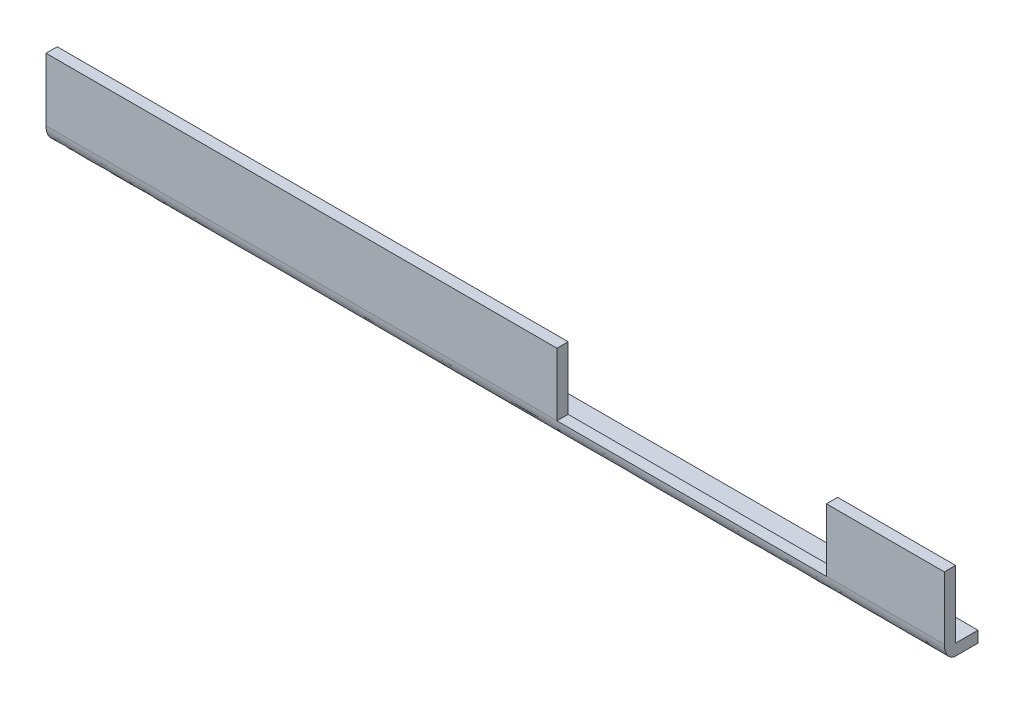
ISO-10303-21;
HEADER;
FILE_DESCRIPTION(('STEP AP214'),'2;1');
FILE_NAME('part.step','',(''),(''),'','','');
FILE_SCHEMA(('AUTOMOTIVE_DESIGN { 1 0 10303 214 1 1 1 1 }'));
ENDSEC;
DATA;
#1=APPLICATION_CONTEXT('core data for automotive mechanical design processes');
#2=APPLICATION_PROTOCOL_DEFINITION('international standard','automotive_design',2000,#1);
#3=PRODUCT_CONTEXT('',#1,'mechanical');
#4=PRODUCT('Part','Part','',(#3));
#5=PRODUCT_RELATED_PRODUCT_CATEGORY('part','',(#4));
#6=PRODUCT_DEFINITION_FORMATION('','',#4);
#7=PRODUCT_DEFINITION_CONTEXT('part definition',#1,'design');
#8=PRODUCT_DEFINITION('design','',#6,#7);
#9=PRODUCT_DEFINITION_SHAPE('','',#8);
#10=(LENGTH_UNIT() NAMED_UNIT(*) SI_UNIT(.MILLI.,.METRE.));
#11=(NAMED_UNIT(*) PLANE_ANGLE_UNIT() SI_UNIT($,.RADIAN.));
#12=(NAMED_UNIT(*) SI_UNIT($,.STERADIAN.) SOLID_ANGLE_UNIT());
#13=UNCERTAINTY_MEASURE_WITH_UNIT(LENGTH_MEASURE(1.E-05),#10,'distance_accuracy_value','');
#14=(GEOMETRIC_REPRESENTATION_CONTEXT(3) GLOBAL_UNCERTAINTY_ASSIGNED_CONTEXT((#13)) GLOBAL_UNIT_ASSIGNED_CONTEXT((#10,
#11,#12)) REPRESENTATION_CONTEXT('',''));
#15=CARTESIAN_POINT('',(0.,0.,0.));
#16=DIRECTION('',(0.,0.,1.));
#17=DIRECTION('',(1.,0.,0.));
#18=AXIS2_PLACEMENT_3D('',#15,#16,#17);
#19=CARTESIAN_POINT('',(-167.295597484277,147.91934618496,5.));
#20=DIRECTION('',(0.,-1.,0.));
#21=DIRECTION('',(0.,0.,-1.));
#22=AXIS2_PLACEMENT_3D('',#19,#20,#21);
#23=PLANE('',#22);
#24=DIRECTION('',(0.,0.,1.));
#25=VECTOR('',#24,1.);
#26=CARTESIAN_POINT('',(60.2044025157233,147.91934618496,-5.));
#27=LINE('',#26,#25);
#28=CARTESIAN_POINT('',(60.2044025157233,147.91934618496,0.));
#29=VERTEX_POINT('',#28);
#30=CARTESIAN_POINT('',(60.2044025157233,147.91934618496,5.));
#31=VERTEX_POINT('',#30);
#32=EDGE_CURVE('E158',#29,#31,#27,.T.);
#33=ORIENTED_EDGE('',*,*,#32,.F.);
#34=DIRECTION('',(-1.,0.,0.));
#35=VECTOR('',#34,1.);
#36=CARTESIAN_POINT('',(-167.295597484277,147.91934618496,0.));
#37=LINE('',#36,#35);
#38=CARTESIAN_POINT('',(-167.295597484277,147.91934618496,0.));
#39=VERTEX_POINT('',#38);
#40=EDGE_CURVE('E180',#29,#39,#37,.T.);
#41=ORIENTED_EDGE('',*,*,#40,.T.);
#42=DIRECTION('',(0.,0.,-1.));
#43=VECTOR('',#42,1.);
#44=CARTESIAN_POINT('',(-167.295597484277,147.91934618496,5.));
#45=LINE('',#44,#43);
#46=CARTESIAN_POINT('',(-167.295597484277,147.91934618496,5.));
#47=VERTEX_POINT('',#46);
#48=EDGE_CURVE('E164',#47,#39,#45,.T.);
#49=ORIENTED_EDGE('',*,*,#48,.F.);
#50=DIRECTION('',(-1.,0.,0.));
#51=VECTOR('',#50,1.);
#52=CARTESIAN_POINT('',(-167.295597484277,147.91934618496,5.));
#53=LINE('',#52,#51);
#54=EDGE_CURVE('E165',#31,#47,#53,.T.);
#55=ORIENTED_EDGE('',*,*,#54,.F.);
#56=EDGE_LOOP('',(#33,#41,#49,#55));
#57=FACE_BOUND('',#56,.T.);
#58=ADVANCED_FACE('F50',(#57),#23,.F.);
#59=CARTESIAN_POINT('',(0.,0.,0.));
#60=DIRECTION('',(0.,0.,1.));
#61=DIRECTION('',(1.,0.,0.));
#62=AXIS2_PLACEMENT_3D('',#59,#60,#61);
#63=PLANE('',#62);
#64=DIRECTION('',(0.,-1.,0.));
#65=VECTOR('',#64,1.);
#66=CARTESIAN_POINT('',(180.204402515723,0.,0.));
#67=LINE('',#66,#65);
#68=CARTESIAN_POINT('',(180.204402515723,147.91934618496,0.));
#69=VERTEX_POINT('',#68);
#70=CARTESIAN_POINT('',(180.204402515723,119.91934618496,0.));
#71=VERTEX_POINT('',#70);
#72=EDGE_CURVE('E331',#69,#71,#67,.T.);
#73=ORIENTED_EDGE('',*,*,#72,.F.);
#74=CARTESIAN_POINT('',(232.704402515723,147.91934618496,0.));
#75=VERTEX_POINT('',#74);
#76=EDGE_CURVE('E157',#75,#69,#37,.T.);
#77=ORIENTED_EDGE('',*,*,#76,.F.);
#78=DIRECTION('',(0.,1.,0.));
#79=VECTOR('',#78,1.);
#80=CARTESIAN_POINT('',(232.704402515723,147.91934618496,0.));
#81=LINE('',#80,#79);
#82=CARTESIAN_POINT('',(232.704402515723,117.91934618496,0.));
#83=VERTEX_POINT('',#82);
#84=EDGE_CURVE('E177',#83,#75,#81,.T.);
#85=ORIENTED_EDGE('',*,*,#84,.F.);
#86=DIRECTION('',(1.,0.,0.));
#87=VECTOR('',#86,1.);
#88=CARTESIAN_POINT('',(232.704402515723,117.91934618496,0.));
#89=LINE('',#88,#87);
#90=CARTESIAN_POINT('',(-167.295597484277,117.91934618496,0.));
#91=VERTEX_POINT('',#90);
#92=EDGE_CURVE('E302',#91,#83,#89,.T.);
#93=ORIENTED_EDGE('',*,*,#92,.F.);
#94=DIRECTION('',(0.,-1.,0.));
#95=VECTOR('',#94,1.);
#96=CARTESIAN_POINT('',(-167.295597484277,147.91934618496,0.));
#97=LINE('',#96,#95);
#98=EDGE_CURVE('E174',#39,#91,#97,.T.);
#99=ORIENTED_EDGE('',*,*,#98,.F.);
#100=ORIENTED_EDGE('',*,*,#40,.F.);
#101=DIRECTION('',(0.,-1.,0.));
#102=VECTOR('',#101,1.);
#103=CARTESIAN_POINT('',(60.2044025157234,0.,0.));
#104=LINE('',#103,#102);
#105=CARTESIAN_POINT('',(60.2044025157233,119.91934618496,0.));
#106=VERTEX_POINT('',#105);
#107=EDGE_CURVE('E300',#29,#106,#104,.T.);
#108=ORIENTED_EDGE('',*,*,#107,.T.);
#109=DIRECTION('',(1.,0.,0.));
#110=VECTOR('',#109,1.);
#111=CARTESIAN_POINT('',(0.,119.91934618496,0.));
#112=LINE('',#111,#110);
#113=EDGE_CURVE('E332',#106,#71,#112,.T.);
#114=ORIENTED_EDGE('',*,*,#113,.T.);
#115=EDGE_LOOP('',(#73,#77,#85,#93,#99,#100,#108,#114));
#116=FACE_BOUND('',#115,.T.);
#117=ADVANCED_FACE('F279',(#116),#63,.F.);
#118=CARTESIAN_POINT('',(0.,0.,5.));
#119=DIRECTION('',(0.,0.,1.));
#120=DIRECTION('',(1.,0.,0.));
#121=AXIS2_PLACEMENT_3D('',#118,#119,#120);
#122=PLANE('',#121);
#123=CARTESIAN_POINT('',(232.704402515723,147.91934618496,5.));
#124=VERTEX_POINT('',#123);
#125=CARTESIAN_POINT('',(180.204402515723,147.91934618496,5.));
#126=VERTEX_POINT('',#125);
#127=EDGE_CURVE('E155',#124,#126,#53,.T.);
#128=ORIENTED_EDGE('',*,*,#127,.T.);
#129=DIRECTION('',(0.,-1.,0.));
#130=VECTOR('',#129,1.);
#131=CARTESIAN_POINT('',(180.204402515723,0.,5.));
#132=LINE('',#131,#130);
#133=CARTESIAN_POINT('',(180.204402515723,119.91934618496,5.));
#134=VERTEX_POINT('',#133);
#135=EDGE_CURVE('E138',#126,#134,#132,.T.);
#136=ORIENTED_EDGE('',*,*,#135,.T.);
#137=CARTESIAN_POINT('',(272.704402515723,119.91934618496,5.));
#138=CARTESIAN_POINT('',(112.704402515723,119.91934618496,5.));
#139=CARTESIAN_POINT('',(-47.2955974842767,119.91934618496,5.));
#140=CARTESIAN_POINT('',(-207.295597484277,119.91934618496,5.));
#141=(BOUNDED_CURVE() B_SPLINE_CURVE(3,(#137,#138,#139,#140),.UNSPECIFIED.,.F.,
.F.) B_SPLINE_CURVE_WITH_KNOTS((4,4),(-0.272704402515723,0.207295597484277),
.UNSPECIFIED.) CURVE() GEOMETRIC_REPRESENTATION_ITEM() RATIONAL_B_SPLINE_CURVE((1.,1.,1.,1.)) REPRESENTATION_ITEM(''));
#142=CARTESIAN_POINT('',(232.704402515723,119.91934618496,5.));
#143=VERTEX_POINT('',#142);
#144=EDGE_CURVE('E259',#134,#143,#141,.F.);
#145=ORIENTED_EDGE('',*,*,#144,.T.);
#146=DIRECTION('',(0.,1.,0.));
#147=VECTOR('',#146,1.);
#148=CARTESIAN_POINT('',(232.704402515723,147.91934618496,5.));
#149=LINE('',#148,#147);
#150=EDGE_CURVE('E162',#143,#124,#149,.T.);
#151=ORIENTED_EDGE('',*,*,#150,.T.);
#152=EDGE_LOOP('',(#128,#136,#145,#151));
#153=FACE_BOUND('',#152,.T.);
#154=ADVANCED_FACE('F161',(#153),#122,.T.);
#155=CARTESIAN_POINT('',(272.704402515723,112.91934618496,0.));
#156=CARTESIAN_POINT('',(112.704402515723,112.91934618496,0.));
#157=CARTESIAN_POINT('',(-47.2955974842767,112.91934618496,0.));
#158=CARTESIAN_POINT('',(-207.295597484277,112.91934618496,0.));
#159=CARTESIAN_POINT('',(272.704402515723,112.91934618496,5.00000000000002));
#160=CARTESIAN_POINT('',(112.704402515723,112.91934618496,5.00000000048574));
#161=CARTESIAN_POINT('',(-47.2955974842764,112.91934618496,5.00000000055513));
#162=CARTESIAN_POINT('',(-207.295597484277,112.91934618496,5.00000000000002));
#163=CARTESIAN_POINT('',(272.704402515723,119.91934618496,5.));
#164=CARTESIAN_POINT('',(112.704402515723,119.91934618496,5.));
#165=CARTESIAN_POINT('',(-47.2955974842767,119.91934618496,5.));
#166=CARTESIAN_POINT('',(-207.295597484277,119.91934618496,5.));
#167=(BOUNDED_SURFACE() B_SPLINE_SURFACE(2,3,((#155,#156,#157,#158),(#159,#160,#161,#162),(#163,
#164,#165,#166)),.UNSPECIFIED.,.F.,.F.,.F.) B_SPLINE_SURFACE_WITH_KNOTS((3,3),(4,4),(0.,1.),
(-0.272704402515723,0.207295597484277),
.UNSPECIFIED.) GEOMETRIC_REPRESENTATION_ITEM() RATIONAL_B_SPLINE_SURFACE(((1.,1.,1.,1.),
(0.707106781186547,0.707106781186547,0.707106781186547,0.707106781186547),(1.,1.,1.,1.))) REPRESENTATION_ITEM('') SURFACE());
#168=CARTESIAN_POINT('',(272.704402515723,119.91934618496,5.));
#169=CARTESIAN_POINT('',(112.704402515723,119.91934618496,5.));
#170=CARTESIAN_POINT('',(-47.2955974842767,119.91934618496,5.));
#171=CARTESIAN_POINT('',(-207.295597484277,119.91934618496,5.));
#172=(BOUNDED_CURVE() B_SPLINE_CURVE(3,(#168,#169,#170,#171),.UNSPECIFIED.,.F.,
.F.) B_SPLINE_CURVE_WITH_KNOTS((4,4),(-0.272704402515723,0.207295597484277),
.UNSPECIFIED.) CURVE() GEOMETRIC_REPRESENTATION_ITEM() RATIONAL_B_SPLINE_CURVE((1.,1.,1.,1.)) REPRESENTATION_ITEM(''));
#173=CARTESIAN_POINT('',(-167.295597484277,119.91934618496,5.));
#174=VERTEX_POINT('',#173);
#175=CARTESIAN_POINT('',(60.2044025157233,119.91934618496,5.));
#176=VERTEX_POINT('',#175);
#177=EDGE_CURVE('E241',#174,#176,#172,.F.);
#178=CARTESIAN_POINT('',(-167.295597484277,119.91934618496,5.));
#179=CARTESIAN_POINT('',(-167.295597484277,112.91934618496,5.00000000012591));
#180=CARTESIAN_POINT('',(-167.295597484277,112.91934618496,0.));
#181=(BOUNDED_CURVE() B_SPLINE_CURVE(2,(#178,#179,#180),.UNSPECIFIED.,.F.,
.F.) B_SPLINE_CURVE_WITH_KNOTS((3,3),(0.,1.),
.UNSPECIFIED.) CURVE() GEOMETRIC_REPRESENTATION_ITEM() RATIONAL_B_SPLINE_CURVE((1.,
0.707106781186547,1.)) REPRESENTATION_ITEM(''));
#182=CARTESIAN_POINT('',(-167.295597484277,112.91934618496,0.));
#183=VERTEX_POINT('',#182);
#184=EDGE_CURVE('E64',#183,#174,#181,.F.);
#185=CARTESIAN_POINT('',(-207.295597484277,112.91934618496,0.));
#186=CARTESIAN_POINT('',(-47.2955974842767,112.91934618496,0.));
#187=CARTESIAN_POINT('',(112.704402515723,112.91934618496,0.));
#188=CARTESIAN_POINT('',(272.704402515723,112.91934618496,0.));
#189=(BOUNDED_CURVE() B_SPLINE_CURVE(3,(#185,#186,#187,#188),.UNSPECIFIED.,.F.,
.F.) B_SPLINE_CURVE_WITH_KNOTS((4,4),(-0.272704402515723,0.207295597484277),
.UNSPECIFIED.) CURVE() GEOMETRIC_REPRESENTATION_ITEM() RATIONAL_B_SPLINE_CURVE((1.,1.,1.,1.)) REPRESENTATION_ITEM(''));
#190=CARTESIAN_POINT('',(232.704402515723,112.91934618496,0.));
#191=VERTEX_POINT('',#190);
#192=EDGE_CURVE('E198',#191,#183,#189,.F.);
#193=CARTESIAN_POINT('',(232.704402515723,112.91934618496,0.));
#194=CARTESIAN_POINT('',(232.704402515723,112.91934618496,5.00000000011265));
#195=CARTESIAN_POINT('',(232.704402515723,119.91934618496,5.));
#196=(BOUNDED_CURVE() B_SPLINE_CURVE(2,(#193,#194,#195),.UNSPECIFIED.,.F.,
.F.) B_SPLINE_CURVE_WITH_KNOTS((3,3),(0.,1.),
.UNSPECIFIED.) CURVE() GEOMETRIC_REPRESENTATION_ITEM() RATIONAL_B_SPLINE_CURVE((1.,
0.707106781186547,1.)) REPRESENTATION_ITEM(''));
#197=EDGE_CURVE('E12',#143,#191,#196,.F.);
#198=CARTESIAN_POINT('',(272.704402515723,119.91934618496,5.));
#199=CARTESIAN_POINT('',(112.704402515723,119.91934618496,5.));
#200=CARTESIAN_POINT('',(-47.2955974842767,119.91934618496,5.));
#201=CARTESIAN_POINT('',(-207.295597484277,119.91934618496,5.));
#202=(BOUNDED_CURVE() B_SPLINE_CURVE(3,(#198,#199,#200,#201),.UNSPECIFIED.,.F.,
.F.) B_SPLINE_CURVE_WITH_KNOTS((4,4),(-0.272704402515723,0.207295597484277),
.UNSPECIFIED.) CURVE() GEOMETRIC_REPRESENTATION_ITEM() RATIONAL_B_SPLINE_CURVE((1.,1.,1.,1.)) REPRESENTATION_ITEM(''));
#203=EDGE_CURVE('E159',#176,#134,#202,.F.);
#204=ORIENTED_EDGE('',*,*,#177,.F.);
#205=ORIENTED_EDGE('',*,*,#184,.F.);
#206=ORIENTED_EDGE('',*,*,#192,.F.);
#207=ORIENTED_EDGE('',*,*,#197,.F.);
#208=ORIENTED_EDGE('',*,*,#144,.F.);
#209=ORIENTED_EDGE('',*,*,#203,.F.);
#210=EDGE_LOOP('',(#204,#205,#206,#207,#208,#209));
#211=FACE_BOUND('',#210,.T.);
#212=ADVANCED_FACE('F53',(#211),#167,.T.);
#213=CARTESIAN_POINT('',(-167.295597484277,147.91934618496,5.));
#214=DIRECTION('',(1.,0.,0.));
#215=DIRECTION('',(0.,1.,0.));
#216=AXIS2_PLACEMENT_3D('',#213,#214,#215);
#217=PLANE('',#216);
#218=DIRECTION('',(0.,0.,-1.));
#219=VECTOR('',#218,1.);
#220=CARTESIAN_POINT('',(-167.295597484277,112.91934618496,5.));
#221=LINE('',#220,#219);
#222=CARTESIAN_POINT('',(-167.295597484277,112.91934618496,-10.));
#223=VERTEX_POINT('',#222);
#224=EDGE_CURVE('E192',#183,#223,#221,.T.);
#225=ORIENTED_EDGE('',*,*,#224,.F.);
#226=ORIENTED_EDGE('',*,*,#184,.T.);
#227=DIRECTION('',(0.,-1.,0.));
#228=VECTOR('',#227,1.);
#229=CARTESIAN_POINT('',(-167.295597484277,147.91934618496,5.));
#230=LINE('',#229,#228);
#231=EDGE_CURVE('E181',#47,#174,#230,.T.);
#232=ORIENTED_EDGE('',*,*,#231,.F.);
#233=ORIENTED_EDGE('',*,*,#48,.T.);
#234=ORIENTED_EDGE('',*,*,#98,.T.);
#235=DIRECTION('',(0.,0.,1.));
#236=VECTOR('',#235,1.);
#237=CARTESIAN_POINT('',(-167.295597484277,117.91934618496,-10.));
#238=LINE('',#237,#236);
#239=CARTESIAN_POINT('',(-167.295597484277,117.91934618496,-10.));
#240=VERTEX_POINT('',#239);
#241=EDGE_CURVE('E178',#240,#91,#238,.T.);
#242=ORIENTED_EDGE('',*,*,#241,.F.);
#243=DIRECTION('',(0.,1.,0.));
#244=VECTOR('',#243,1.);
#245=CARTESIAN_POINT('',(-167.295597484277,117.91934618496,-10.));
#246=LINE('',#245,#244);
#247=EDGE_CURVE('E324',#223,#240,#246,.T.);
#248=ORIENTED_EDGE('',*,*,#247,.F.);
#249=EDGE_LOOP('',(#225,#226,#232,#233,#234,#242,#248));
#250=FACE_BOUND('',#249,.T.);
#251=ADVANCED_FACE('F215',(#250),#217,.F.);
#252=CARTESIAN_POINT('',(-167.295597484277,112.91934618496,5.));
#253=DIRECTION('',(0.,1.,0.));
#254=DIRECTION('',(0.,0.,1.));
#255=AXIS2_PLACEMENT_3D('',#252,#253,#254);
#256=PLANE('',#255);
#257=DIRECTION('',(0.,0.,-1.));
#258=VECTOR('',#257,1.);
#259=CARTESIAN_POINT('',(232.704402515723,112.91934618496,5.));
#260=LINE('',#259,#258);
#261=CARTESIAN_POINT('',(232.704402515723,112.91934618496,-10.));
#262=VERTEX_POINT('',#261);
#263=EDGE_CURVE('E184',#191,#262,#260,.T.);
#264=ORIENTED_EDGE('',*,*,#263,.F.);
#265=ORIENTED_EDGE('',*,*,#192,.T.);
#266=ORIENTED_EDGE('',*,*,#224,.T.);
#267=DIRECTION('',(-1.,0.,0.));
#268=VECTOR('',#267,1.);
#269=CARTESIAN_POINT('',(232.704402515723,112.91934618496,-10.));
#270=LINE('',#269,#268);
#271=EDGE_CURVE('E320',#262,#223,#270,.T.);
#272=ORIENTED_EDGE('',*,*,#271,.F.);
#273=EDGE_LOOP('',(#264,#265,#266,#272));
#274=FACE_BOUND('',#273,.T.);
#275=ADVANCED_FACE('F205',(#274),#256,.F.);
#276=CARTESIAN_POINT('',(232.704402515723,147.91934618496,5.));
#277=DIRECTION('',(-1.,0.,0.));
#278=DIRECTION('',(0.,-1.,0.));
#279=AXIS2_PLACEMENT_3D('',#276,#277,#278);
#280=PLANE('',#279);
#281=ORIENTED_EDGE('',*,*,#150,.F.);
#282=ORIENTED_EDGE('',*,*,#197,.T.);
#283=ORIENTED_EDGE('',*,*,#263,.T.);
#284=DIRECTION('',(0.,-1.,0.));
#285=VECTOR('',#284,1.);
#286=CARTESIAN_POINT('',(232.704402515723,117.91934618496,-10.));
#287=LINE('',#286,#285);
#288=CARTESIAN_POINT('',(232.704402515723,117.91934618496,-10.));
#289=VERTEX_POINT('',#288);
#290=EDGE_CURVE('E326',#289,#262,#287,.T.);
#291=ORIENTED_EDGE('',*,*,#290,.F.);
#292=DIRECTION('',(0.,0.,1.));
#293=VECTOR('',#292,1.);
#294=CARTESIAN_POINT('',(232.704402515723,117.91934618496,-10.));
#295=LINE('',#294,#293);
#296=EDGE_CURVE('E312',#289,#83,#295,.T.);
#297=ORIENTED_EDGE('',*,*,#296,.T.);
#298=ORIENTED_EDGE('',*,*,#84,.T.);
#299=DIRECTION('',(0.,0.,-1.));
#300=VECTOR('',#299,1.);
#301=CARTESIAN_POINT('',(232.704402515723,147.91934618496,5.));
#302=LINE('',#301,#300);
#303=EDGE_CURVE('E168',#124,#75,#302,.T.);
#304=ORIENTED_EDGE('',*,*,#303,.F.);
#305=EDGE_LOOP('',(#281,#282,#283,#291,#297,#298,#304));
#306=FACE_BOUND('',#305,.T.);
#307=ADVANCED_FACE('F214',(#306),#280,.F.);
#308=ORIENTED_EDGE('',*,*,#76,.T.);
#309=DIRECTION('',(0.,0.,1.));
#310=VECTOR('',#309,1.);
#311=CARTESIAN_POINT('',(180.204402515723,147.91934618496,-5.));
#312=LINE('',#311,#310);
#313=EDGE_CURVE('E141',#69,#126,#312,.T.);
#314=ORIENTED_EDGE('',*,*,#313,.T.);
#315=ORIENTED_EDGE('',*,*,#127,.F.);
#316=ORIENTED_EDGE('',*,*,#303,.T.);
#317=EDGE_LOOP('',(#308,#314,#315,#316));
#318=FACE_BOUND('',#317,.T.);
#319=ADVANCED_FACE('F153',(#318),#23,.F.);
#320=DIRECTION('',(0.,-1.,0.));
#321=VECTOR('',#320,1.);
#322=CARTESIAN_POINT('',(60.2044025157234,0.,5.));
#323=LINE('',#322,#321);
#324=EDGE_CURVE('E148',#31,#176,#323,.T.);
#325=ORIENTED_EDGE('',*,*,#324,.F.);
#326=ORIENTED_EDGE('',*,*,#54,.T.);
#327=ORIENTED_EDGE('',*,*,#231,.T.);
#328=ORIENTED_EDGE('',*,*,#177,.T.);
#329=EDGE_LOOP('',(#325,#326,#327,#328));
#330=FACE_BOUND('',#329,.T.);
#331=ADVANCED_FACE('F266',(#330),#122,.T.);
#332=CARTESIAN_POINT('',(232.704402515723,117.91934618496,-10.));
#333=DIRECTION('',(0.,-1.,0.));
#334=DIRECTION('',(0.,0.,-1.));
#335=AXIS2_PLACEMENT_3D('',#332,#333,#334);
#336=PLANE('',#335);
#337=ORIENTED_EDGE('',*,*,#92,.T.);
#338=ORIENTED_EDGE('',*,*,#296,.F.);
#339=DIRECTION('',(1.,0.,0.));
#340=VECTOR('',#339,1.);
#341=CARTESIAN_POINT('',(232.704402515723,117.91934618496,-10.));
#342=LINE('',#341,#340);
#343=EDGE_CURVE('E311',#240,#289,#342,.T.);
#344=ORIENTED_EDGE('',*,*,#343,.F.);
#345=ORIENTED_EDGE('',*,*,#241,.T.);
#346=EDGE_LOOP('',(#337,#338,#344,#345));
#347=FACE_BOUND('',#346,.T.);
#348=ADVANCED_FACE('F276',(#347),#336,.F.);
#349=CARTESIAN_POINT('',(0.,0.,-10.));
#350=DIRECTION('',(0.,0.,-1.));
#351=DIRECTION('',(-1.,0.,0.));
#352=AXIS2_PLACEMENT_3D('',#349,#350,#351);
#353=PLANE('',#352);
#354=ORIENTED_EDGE('',*,*,#290,.T.);
#355=ORIENTED_EDGE('',*,*,#271,.T.);
#356=ORIENTED_EDGE('',*,*,#247,.T.);
#357=ORIENTED_EDGE('',*,*,#343,.T.);
#358=EDGE_LOOP('',(#354,#355,#356,#357));
#359=FACE_BOUND('',#358,.T.);
#360=ADVANCED_FACE('F323',(#359),#353,.T.);
#361=CARTESIAN_POINT('',(180.204402515723,0.,-5.));
#362=DIRECTION('',(-1.,0.,0.));
#363=DIRECTION('',(0.,0.,1.));
#364=AXIS2_PLACEMENT_3D('',#361,#362,#363);
#365=PLANE('',#364);
#366=ORIENTED_EDGE('',*,*,#72,.T.);
#367=DIRECTION('',(0.,0.,1.));
#368=VECTOR('',#367,1.);
#369=CARTESIAN_POINT('',(180.204402515723,119.91934618496,-5.));
#370=LINE('',#369,#368);
#371=EDGE_CURVE('E144',#71,#134,#370,.T.);
#372=ORIENTED_EDGE('',*,*,#371,.T.);
#373=ORIENTED_EDGE('',*,*,#135,.F.);
#374=ORIENTED_EDGE('',*,*,#313,.F.);
#375=EDGE_LOOP('',(#366,#372,#373,#374));
#376=FACE_BOUND('',#375,.T.);
#377=ADVANCED_FACE('F140',(#376),#365,.T.);
#378=CARTESIAN_POINT('',(0.,119.91934618496,-5.));
#379=DIRECTION('',(0.,-1.,0.));
#380=DIRECTION('',(0.,0.,-1.));
#381=AXIS2_PLACEMENT_3D('',#378,#379,#380);
#382=PLANE('',#381);
#383=DIRECTION('',(0.,0.,1.));
#384=VECTOR('',#383,1.);
#385=CARTESIAN_POINT('',(60.2044025157233,119.91934618496,-5.));
#386=LINE('',#385,#384);
#387=EDGE_CURVE('E71',#106,#176,#386,.T.);
#388=ORIENTED_EDGE('',*,*,#387,.T.);
#389=ORIENTED_EDGE('',*,*,#203,.T.);
#390=ORIENTED_EDGE('',*,*,#371,.F.);
#391=ORIENTED_EDGE('',*,*,#113,.F.);
#392=EDGE_LOOP('',(#388,#389,#390,#391));
#393=FACE_BOUND('',#392,.T.);
#394=ADVANCED_FACE('F350',(#393),#382,.F.);
#395=CARTESIAN_POINT('',(60.2044025157234,0.,-5.));
#396=DIRECTION('',(-1.,0.,0.));
#397=DIRECTION('',(0.,-1.,0.));
#398=AXIS2_PLACEMENT_3D('',#395,#396,#397);
#399=PLANE('',#398);
#400=ORIENTED_EDGE('',*,*,#32,.T.);
#401=ORIENTED_EDGE('',*,*,#324,.T.);
#402=ORIENTED_EDGE('',*,*,#387,.F.);
#403=ORIENTED_EDGE('',*,*,#107,.F.);
#404=EDGE_LOOP('',(#400,#401,#402,#403));
#405=FACE_BOUND('',#404,.T.);
#406=ADVANCED_FACE('F359',(#405),#399,.F.);
#407=CLOSED_SHELL('',(#58,#117,#154,#212,#251,#275,#307,#319,#331,#348,#360,#377,#394,#406));
#408=MANIFOLD_SOLID_BREP('B2',#407);
#409=ADVANCED_BREP_SHAPE_REPRESENTATION('',(#18,#408),#14);
#410=SHAPE_DEFINITION_REPRESENTATION(#9,#409);
ENDSEC;
END-ISO-10303-21;
